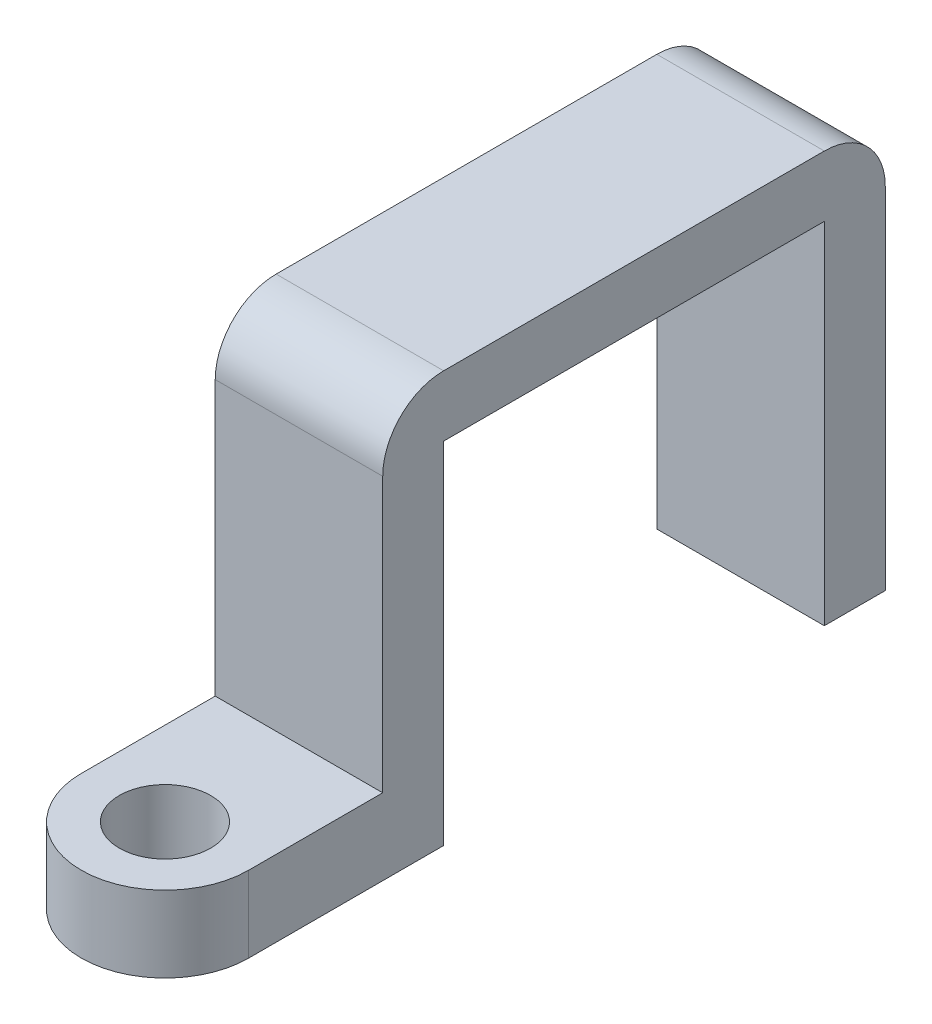
ISO-10303-21;
HEADER;
FILE_DESCRIPTION(('STEP AP214'),'2;1');
FILE_NAME('part.step','',(''),(''),'','','');
FILE_SCHEMA(('AUTOMOTIVE_DESIGN { 1 0 10303 214 1 1 1 1 }'));
ENDSEC;
DATA;
#1=APPLICATION_CONTEXT('core data for automotive mechanical design processes');
#2=APPLICATION_PROTOCOL_DEFINITION('international standard','automotive_design',2000,#1);
#3=PRODUCT_CONTEXT('',#1,'mechanical');
#4=PRODUCT('Part','Part','',(#3));
#5=PRODUCT_RELATED_PRODUCT_CATEGORY('part','',(#4));
#6=PRODUCT_DEFINITION_FORMATION('','',#4);
#7=PRODUCT_DEFINITION_CONTEXT('part definition',#1,'design');
#8=PRODUCT_DEFINITION('design','',#6,#7);
#9=PRODUCT_DEFINITION_SHAPE('','',#8);
#10=(LENGTH_UNIT() NAMED_UNIT(*) SI_UNIT(.MILLI.,.METRE.));
#11=(NAMED_UNIT(*) PLANE_ANGLE_UNIT() SI_UNIT($,.RADIAN.));
#12=(NAMED_UNIT(*) SI_UNIT($,.STERADIAN.) SOLID_ANGLE_UNIT());
#13=UNCERTAINTY_MEASURE_WITH_UNIT(LENGTH_MEASURE(1.E-05),#10,'distance_accuracy_value','');
#14=(GEOMETRIC_REPRESENTATION_CONTEXT(3) GLOBAL_UNCERTAINTY_ASSIGNED_CONTEXT((#13)) GLOBAL_UNIT_ASSIGNED_CONTEXT((#10,
#11,#12)) REPRESENTATION_CONTEXT('',''));
#15=CARTESIAN_POINT('',(0.,0.,0.));
#16=DIRECTION('',(0.,0.,1.));
#17=DIRECTION('',(1.,0.,0.));
#18=AXIS2_PLACEMENT_3D('',#15,#16,#17);
#19=CARTESIAN_POINT('',(0.,11.5,0.));
#20=DIRECTION('',(0.,-1.,0.));
#21=DIRECTION('',(0.,0.,-1.));
#22=AXIS2_PLACEMENT_3D('',#19,#20,#21);
#23=PLANE('',#22);
#24=DIRECTION('',(0.,0.,1.));
#25=VECTOR('',#24,1.);
#26=CARTESIAN_POINT('',(-2.75,11.5,-20.9));
#27=LINE('',#26,#25);
#28=CARTESIAN_POINT('',(-2.75,11.5,-18.9));
#29=VERTEX_POINT('',#28);
#30=CARTESIAN_POINT('',(-2.75,11.5,-6.4));
#31=VERTEX_POINT('',#30);
#32=EDGE_CURVE('E179',#29,#31,#27,.T.);
#33=ORIENTED_EDGE('',*,*,#32,.F.);
#34=DIRECTION('',(-1.,0.,0.));
#35=VECTOR('',#34,1.);
#36=CARTESIAN_POINT('',(-2.75,11.5,-18.9));
#37=LINE('',#36,#35);
#38=CARTESIAN_POINT('',(2.75,11.5,-18.9));
#39=VERTEX_POINT('',#38);
#40=EDGE_CURVE('E159',#39,#29,#37,.T.);
#41=ORIENTED_EDGE('',*,*,#40,.F.);
#42=DIRECTION('',(0.,0.,-1.));
#43=VECTOR('',#42,1.);
#44=CARTESIAN_POINT('',(2.75,11.5,-20.9));
#45=LINE('',#44,#43);
#46=CARTESIAN_POINT('',(2.75,11.5,-6.4));
#47=VERTEX_POINT('',#46);
#48=EDGE_CURVE('E174',#47,#39,#45,.T.);
#49=ORIENTED_EDGE('',*,*,#48,.F.);
#50=DIRECTION('',(-1.,0.,0.));
#51=VECTOR('',#50,1.);
#52=CARTESIAN_POINT('',(2.75,11.5,-6.4));
#53=LINE('',#52,#51);
#54=EDGE_CURVE('E191',#47,#31,#53,.T.);
#55=ORIENTED_EDGE('',*,*,#54,.T.);
#56=EDGE_LOOP('',(#33,#41,#49,#55));
#57=FACE_BOUND('',#56,.T.);
#58=ADVANCED_FACE('F45',(#57),#23,.T.);
#59=CARTESIAN_POINT('',(0.,2.5,0.));
#60=DIRECTION('',(0.,1.,0.));
#61=DIRECTION('',(0.,0.,1.));
#62=AXIS2_PLACEMENT_3D('',#59,#60,#61);
#63=PLANE('',#62);
#64=DIRECTION('',(1.,0.,0.));
#65=VECTOR('',#64,1.);
#66=CARTESIAN_POINT('',(-2.75,2.5,-4.4));
#67=LINE('',#66,#65);
#68=CARTESIAN_POINT('',(-2.75,2.5,-4.4));
#69=VERTEX_POINT('',#68);
#70=CARTESIAN_POINT('',(2.75,2.5,-4.4));
#71=VERTEX_POINT('',#70);
#72=EDGE_CURVE('E190',#69,#71,#67,.T.);
#73=ORIENTED_EDGE('',*,*,#72,.F.);
#74=DIRECTION('',(0.,0.,1.));
#75=VECTOR('',#74,1.);
#76=CARTESIAN_POINT('',(-2.75,2.5,0.));
#77=LINE('',#76,#75);
#78=CARTESIAN_POINT('',(-2.75,2.5,0.));
#79=VERTEX_POINT('',#78);
#80=EDGE_CURVE('E222',#69,#79,#77,.T.);
#81=ORIENTED_EDGE('',*,*,#80,.T.);
#82=CARTESIAN_POINT('',(0.,2.5,0.));
#83=DIRECTION('',(0.,1.,0.));
#84=DIRECTION('',(0.,0.,1.));
#85=AXIS2_PLACEMENT_3D('',#82,#83,#84);
#86=CIRCLE('',#85,2.75);
#87=CARTESIAN_POINT('',(2.75,2.5,0.));
#88=VERTEX_POINT('',#87);
#89=EDGE_CURVE('E213',#79,#88,#86,.T.);
#90=ORIENTED_EDGE('',*,*,#89,.T.);
#91=DIRECTION('',(0.,0.,-1.));
#92=VECTOR('',#91,1.);
#93=CARTESIAN_POINT('',(2.75,2.5,0.));
#94=LINE('',#93,#92);
#95=EDGE_CURVE('E217',#88,#71,#94,.T.);
#96=ORIENTED_EDGE('',*,*,#95,.T.);
#97=EDGE_LOOP('',(#73,#81,#90,#96));
#98=FACE_BOUND('',#97,.T.);
#99=CARTESIAN_POINT('',(0.,2.5,0.));
#100=DIRECTION('',(0.,1.,0.));
#101=DIRECTION('',(0.,0.,1.));
#102=AXIS2_PLACEMENT_3D('',#99,#100,#101);
#103=CIRCLE('',#102,1.5);
#104=CARTESIAN_POINT('',(0.,2.5,1.5));
#105=VERTEX_POINT('',#104);
#106=EDGE_CURVE('E205',#105,#105,#103,.T.);
#107=ORIENTED_EDGE('',*,*,#106,.F.);
#108=EDGE_LOOP('',(#107));
#109=FACE_BOUND('',#108,.T.);
#110=ADVANCED_FACE('F284',(#98,#109),#63,.T.);
#111=CARTESIAN_POINT('',(0.,0.,0.));
#112=DIRECTION('',(0.,1.,0.));
#113=DIRECTION('',(0.,0.,1.));
#114=AXIS2_PLACEMENT_3D('',#111,#112,#113);
#115=PLANE('',#114);
#116=CARTESIAN_POINT('',(0.,0.,0.));
#117=DIRECTION('',(0.,1.,0.));
#118=DIRECTION('',(0.,0.,1.));
#119=AXIS2_PLACEMENT_3D('',#116,#117,#118);
#120=CIRCLE('',#119,2.75);
#121=CARTESIAN_POINT('',(-2.75,0.,0.));
#122=VERTEX_POINT('',#121);
#123=CARTESIAN_POINT('',(2.75,0.,0.));
#124=VERTEX_POINT('',#123);
#125=EDGE_CURVE('E209',#122,#124,#120,.T.);
#126=ORIENTED_EDGE('',*,*,#125,.F.);
#127=DIRECTION('',(0.,0.,1.));
#128=VECTOR('',#127,1.);
#129=CARTESIAN_POINT('',(-2.75,0.,0.));
#130=LINE('',#129,#128);
#131=CARTESIAN_POINT('',(-2.75,0.,-6.4));
#132=VERTEX_POINT('',#131);
#133=EDGE_CURVE('E218',#132,#122,#130,.T.);
#134=ORIENTED_EDGE('',*,*,#133,.F.);
#135=DIRECTION('',(-1.,0.,0.));
#136=VECTOR('',#135,1.);
#137=CARTESIAN_POINT('',(-2.75,0.,-6.4));
#138=LINE('',#137,#136);
#139=CARTESIAN_POINT('',(2.75,0.,-6.4));
#140=VERTEX_POINT('',#139);
#141=EDGE_CURVE('E232',#140,#132,#138,.T.);
#142=ORIENTED_EDGE('',*,*,#141,.F.);
#143=DIRECTION('',(0.,0.,-1.));
#144=VECTOR('',#143,1.);
#145=CARTESIAN_POINT('',(2.75,0.,0.));
#146=LINE('',#145,#144);
#147=EDGE_CURVE('E229',#124,#140,#146,.T.);
#148=ORIENTED_EDGE('',*,*,#147,.F.);
#149=EDGE_LOOP('',(#126,#134,#142,#148));
#150=FACE_BOUND('',#149,.T.);
#151=CARTESIAN_POINT('',(0.,0.,0.));
#152=DIRECTION('',(0.,1.,0.));
#153=DIRECTION('',(0.,0.,1.));
#154=AXIS2_PLACEMENT_3D('',#151,#152,#153);
#155=CIRCLE('',#154,1.5);
#156=CARTESIAN_POINT('',(0.,0.,1.5));
#157=VERTEX_POINT('',#156);
#158=EDGE_CURVE('E204',#157,#157,#155,.T.);
#159=ORIENTED_EDGE('',*,*,#158,.T.);
#160=EDGE_LOOP('',(#159));
#161=FACE_BOUND('',#160,.T.);
#162=ADVANCED_FACE('F300',(#150,#161),#115,.F.);
#163=CARTESIAN_POINT('',(0.,2.5,0.));
#164=DIRECTION('',(0.,-1.,0.));
#165=DIRECTION('',(0.,0.,-1.));
#166=AXIS2_PLACEMENT_3D('',#163,#164,#165);
#167=CYLINDRICAL_SURFACE('',#166,2.75);
#168=ORIENTED_EDGE('',*,*,#125,.T.);
#169=DIRECTION('',(0.,-1.,0.));
#170=VECTOR('',#169,1.);
#171=CARTESIAN_POINT('',(2.75,2.5,0.));
#172=LINE('',#171,#170);
#173=EDGE_CURVE('E248',#88,#124,#172,.T.);
#174=ORIENTED_EDGE('',*,*,#173,.F.);
#175=ORIENTED_EDGE('',*,*,#89,.F.);
#176=DIRECTION('',(0.,-1.,0.));
#177=VECTOR('',#176,1.);
#178=CARTESIAN_POINT('',(-2.75,2.5,0.));
#179=LINE('',#178,#177);
#180=EDGE_CURVE('E225',#79,#122,#179,.T.);
#181=ORIENTED_EDGE('',*,*,#180,.T.);
#182=EDGE_LOOP('',(#168,#174,#175,#181));
#183=FACE_BOUND('',#182,.T.);
#184=ADVANCED_FACE('F292',(#183),#167,.T.);
#185=CARTESIAN_POINT('',(2.75,2.5,0.));
#186=DIRECTION('',(-1.,0.,0.));
#187=DIRECTION('',(0.,0.,1.));
#188=AXIS2_PLACEMENT_3D('',#185,#186,#187);
#189=PLANE('',#188);
#190=DIRECTION('',(0.,0.,-1.));
#191=VECTOR('',#190,1.);
#192=CARTESIAN_POINT('',(2.75,13.5,-20.9));
#193=LINE('',#192,#191);
#194=CARTESIAN_POINT('',(2.75,13.5,-6.4));
#195=VERTEX_POINT('',#194);
#196=CARTESIAN_POINT('',(2.75,13.5,-18.9));
#197=VERTEX_POINT('',#196);
#198=EDGE_CURVE('E175',#195,#197,#193,.T.);
#199=ORIENTED_EDGE('',*,*,#198,.F.);
#200=CARTESIAN_POINT('',(2.75,11.5,-6.4));
#201=DIRECTION('',(-1.,0.,0.));
#202=DIRECTION('',(0.,0.,1.));
#203=AXIS2_PLACEMENT_3D('',#200,#201,#202);
#204=CIRCLE('',#203,2.);
#205=CARTESIAN_POINT('',(2.75,11.5,-4.4));
#206=VERTEX_POINT('',#205);
#207=EDGE_CURVE('E263',#195,#206,#204,.F.);
#208=ORIENTED_EDGE('',*,*,#207,.T.);
#209=DIRECTION('',(0.,-1.,0.));
#210=VECTOR('',#209,1.);
#211=CARTESIAN_POINT('',(2.75,11.5,-4.4));
#212=LINE('',#211,#210);
#213=EDGE_CURVE('E195',#206,#71,#212,.T.);
#214=ORIENTED_EDGE('',*,*,#213,.T.);
#215=ORIENTED_EDGE('',*,*,#95,.F.);
#216=ORIENTED_EDGE('',*,*,#173,.T.);
#217=ORIENTED_EDGE('',*,*,#147,.T.);
#218=DIRECTION('',(0.,-1.,0.));
#219=VECTOR('',#218,1.);
#220=CARTESIAN_POINT('',(2.75,2.5,-6.4));
#221=LINE('',#220,#219);
#222=EDGE_CURVE('E244',#47,#140,#221,.T.);
#223=ORIENTED_EDGE('',*,*,#222,.F.);
#224=ORIENTED_EDGE('',*,*,#48,.T.);
#225=DIRECTION('',(0.,1.,0.));
#226=VECTOR('',#225,1.);
#227=CARTESIAN_POINT('',(2.75,0.,-18.9));
#228=LINE('',#227,#226);
#229=CARTESIAN_POINT('',(2.75,0.,-18.9));
#230=VERTEX_POINT('',#229);
#231=EDGE_CURVE('E171',#230,#39,#228,.T.);
#232=ORIENTED_EDGE('',*,*,#231,.F.);
#233=DIRECTION('',(0.,0.,1.));
#234=VECTOR('',#233,1.);
#235=CARTESIAN_POINT('',(2.75,0.,-20.9));
#236=LINE('',#235,#234);
#237=CARTESIAN_POINT('',(2.75,0.,-20.9));
#238=VERTEX_POINT('',#237);
#239=EDGE_CURVE('E152',#238,#230,#236,.T.);
#240=ORIENTED_EDGE('',*,*,#239,.F.);
#241=DIRECTION('',(0.,-1.,0.));
#242=VECTOR('',#241,1.);
#243=CARTESIAN_POINT('',(2.75,13.5,-20.9));
#244=LINE('',#243,#242);
#245=CARTESIAN_POINT('',(2.75,11.5,-20.9));
#246=VERTEX_POINT('',#245);
#247=EDGE_CURVE('E142',#246,#238,#244,.T.);
#248=ORIENTED_EDGE('',*,*,#247,.F.);
#249=CARTESIAN_POINT('',(2.75,11.5,-18.9));
#250=DIRECTION('',(-1.,0.,0.));
#251=DIRECTION('',(0.,0.,1.));
#252=AXIS2_PLACEMENT_3D('',#249,#250,#251);
#253=CIRCLE('',#252,2.);
#254=EDGE_CURVE('E260',#246,#197,#253,.F.);
#255=ORIENTED_EDGE('',*,*,#254,.T.);
#256=EDGE_LOOP('',(#199,#208,#214,#215,#216,#217,#223,#224,#232,#240,#248,#255));
#257=FACE_BOUND('',#256,.T.);
#258=ADVANCED_FACE('F280',(#257),#189,.F.);
#259=CARTESIAN_POINT('',(-2.75,2.5,-6.4));
#260=DIRECTION('',(0.,0.,1.));
#261=DIRECTION('',(1.,0.,0.));
#262=AXIS2_PLACEMENT_3D('',#259,#260,#261);
#263=PLANE('',#262);
#264=ORIENTED_EDGE('',*,*,#141,.T.);
#265=DIRECTION('',(0.,-1.,0.));
#266=VECTOR('',#265,1.);
#267=CARTESIAN_POINT('',(-2.75,2.5,-6.4));
#268=LINE('',#267,#266);
#269=EDGE_CURVE('E240',#31,#132,#268,.T.);
#270=ORIENTED_EDGE('',*,*,#269,.F.);
#271=ORIENTED_EDGE('',*,*,#54,.F.);
#272=ORIENTED_EDGE('',*,*,#222,.T.);
#273=EDGE_LOOP('',(#264,#270,#271,#272));
#274=FACE_BOUND('',#273,.T.);
#275=ADVANCED_FACE('F297',(#274),#263,.F.);
#276=CARTESIAN_POINT('',(-2.75,2.5,0.));
#277=DIRECTION('',(1.,0.,0.));
#278=DIRECTION('',(0.,0.,-1.));
#279=AXIS2_PLACEMENT_3D('',#276,#277,#278);
#280=PLANE('',#279);
#281=DIRECTION('',(0.,-1.,0.));
#282=VECTOR('',#281,1.);
#283=CARTESIAN_POINT('',(-2.75,11.5,-4.4));
#284=LINE('',#283,#282);
#285=CARTESIAN_POINT('',(-2.75,11.5,-4.4));
#286=VERTEX_POINT('',#285);
#287=EDGE_CURVE('E201',#286,#69,#284,.T.);
#288=ORIENTED_EDGE('',*,*,#287,.F.);
#289=CARTESIAN_POINT('',(-2.75,11.5,-6.4));
#290=DIRECTION('',(1.,0.,0.));
#291=DIRECTION('',(0.,0.,-1.));
#292=AXIS2_PLACEMENT_3D('',#289,#290,#291);
#293=CIRCLE('',#292,2.);
#294=CARTESIAN_POINT('',(-2.75,13.5,-6.4));
#295=VERTEX_POINT('',#294);
#296=EDGE_CURVE('E54',#286,#295,#293,.F.);
#297=ORIENTED_EDGE('',*,*,#296,.T.);
#298=DIRECTION('',(0.,0.,1.));
#299=VECTOR('',#298,1.);
#300=CARTESIAN_POINT('',(-2.75,13.5,-20.9));
#301=LINE('',#300,#299);
#302=CARTESIAN_POINT('',(-2.75,13.5,-18.9));
#303=VERTEX_POINT('',#302);
#304=EDGE_CURVE('E143',#303,#295,#301,.T.);
#305=ORIENTED_EDGE('',*,*,#304,.F.);
#306=CARTESIAN_POINT('',(-2.75,11.5,-18.9));
#307=DIRECTION('',(1.,0.,0.));
#308=DIRECTION('',(0.,0.,-1.));
#309=AXIS2_PLACEMENT_3D('',#306,#307,#308);
#310=CIRCLE('',#309,2.);
#311=CARTESIAN_POINT('',(-2.75,11.5,-20.9));
#312=VERTEX_POINT('',#311);
#313=EDGE_CURVE('E61',#303,#312,#310,.F.);
#314=ORIENTED_EDGE('',*,*,#313,.T.);
#315=DIRECTION('',(0.,-1.,0.));
#316=VECTOR('',#315,1.);
#317=CARTESIAN_POINT('',(-2.75,13.5,-20.9));
#318=LINE('',#317,#316);
#319=CARTESIAN_POINT('',(-2.75,0.,-20.9));
#320=VERTEX_POINT('',#319);
#321=EDGE_CURVE('E133',#312,#320,#318,.T.);
#322=ORIENTED_EDGE('',*,*,#321,.T.);
#323=DIRECTION('',(0.,0.,-1.));
#324=VECTOR('',#323,1.);
#325=CARTESIAN_POINT('',(-2.75,0.,-20.9));
#326=LINE('',#325,#324);
#327=CARTESIAN_POINT('',(-2.75,0.,-18.9));
#328=VERTEX_POINT('',#327);
#329=EDGE_CURVE('E138',#328,#320,#326,.T.);
#330=ORIENTED_EDGE('',*,*,#329,.F.);
#331=DIRECTION('',(0.,1.,0.));
#332=VECTOR('',#331,1.);
#333=CARTESIAN_POINT('',(-2.75,0.,-18.9));
#334=LINE('',#333,#332);
#335=EDGE_CURVE('E167',#328,#29,#334,.T.);
#336=ORIENTED_EDGE('',*,*,#335,.T.);
#337=ORIENTED_EDGE('',*,*,#32,.T.);
#338=ORIENTED_EDGE('',*,*,#269,.T.);
#339=ORIENTED_EDGE('',*,*,#133,.T.);
#340=ORIENTED_EDGE('',*,*,#180,.F.);
#341=ORIENTED_EDGE('',*,*,#80,.F.);
#342=EDGE_LOOP('',(#288,#297,#305,#314,#322,#330,#336,#337,#338,#339,#340,#341));
#343=FACE_BOUND('',#342,.T.);
#344=ADVANCED_FACE('F135',(#343),#280,.F.);
#345=CARTESIAN_POINT('',(0.,2.5,0.));
#346=DIRECTION('',(0.,-1.,0.));
#347=DIRECTION('',(0.,0.,-1.));
#348=AXIS2_PLACEMENT_3D('',#345,#346,#347);
#349=CYLINDRICAL_SURFACE('',#348,1.5);
#350=ORIENTED_EDGE('',*,*,#106,.T.);
#351=EDGE_LOOP('',(#350));
#352=FACE_BOUND('',#351,.T.);
#353=ORIENTED_EDGE('',*,*,#158,.F.);
#354=EDGE_LOOP('',(#353));
#355=FACE_BOUND('',#354,.T.);
#356=ADVANCED_FACE('F306',(#352,#355),#349,.F.);
#357=CARTESIAN_POINT('',(-2.75,11.5,-4.4));
#358=DIRECTION('',(0.,0.,-1.));
#359=DIRECTION('',(-1.,0.,0.));
#360=AXIS2_PLACEMENT_3D('',#357,#358,#359);
#361=PLANE('',#360);
#362=ORIENTED_EDGE('',*,*,#213,.F.);
#363=DIRECTION('',(1.,0.,0.));
#364=VECTOR('',#363,1.);
#365=CARTESIAN_POINT('',(-2.75,11.5,-4.4));
#366=LINE('',#365,#364);
#367=EDGE_CURVE('E69',#206,#286,#366,.F.);
#368=ORIENTED_EDGE('',*,*,#367,.T.);
#369=ORIENTED_EDGE('',*,*,#287,.T.);
#370=ORIENTED_EDGE('',*,*,#72,.T.);
#371=EDGE_LOOP('',(#362,#368,#369,#370));
#372=FACE_BOUND('',#371,.T.);
#373=ADVANCED_FACE('F281',(#372),#361,.F.);
#374=CARTESIAN_POINT('',(2.75,13.5,-20.9));
#375=DIRECTION('',(0.,0.,1.));
#376=DIRECTION('',(1.,0.,0.));
#377=AXIS2_PLACEMENT_3D('',#374,#375,#376);
#378=PLANE('',#377);
#379=ORIENTED_EDGE('',*,*,#321,.F.);
#380=DIRECTION('',(-1.,0.,0.));
#381=VECTOR('',#380,1.);
#382=CARTESIAN_POINT('',(2.75,11.5,-20.9));
#383=LINE('',#382,#381);
#384=EDGE_CURVE('E11',#312,#246,#383,.F.);
#385=ORIENTED_EDGE('',*,*,#384,.T.);
#386=ORIENTED_EDGE('',*,*,#247,.T.);
#387=DIRECTION('',(1.,0.,0.));
#388=VECTOR('',#387,1.);
#389=CARTESIAN_POINT('',(-2.75,0.,-20.9));
#390=LINE('',#389,#388);
#391=EDGE_CURVE('E146',#320,#238,#390,.T.);
#392=ORIENTED_EDGE('',*,*,#391,.F.);
#393=EDGE_LOOP('',(#379,#385,#386,#392));
#394=FACE_BOUND('',#393,.T.);
#395=ADVANCED_FACE('F147',(#394),#378,.F.);
#396=CARTESIAN_POINT('',(0.,13.5,0.));
#397=DIRECTION('',(0.,-1.,0.));
#398=DIRECTION('',(0.,0.,-1.));
#399=AXIS2_PLACEMENT_3D('',#396,#397,#398);
#400=PLANE('',#399);
#401=ORIENTED_EDGE('',*,*,#304,.T.);
#402=DIRECTION('',(1.,0.,0.));
#403=VECTOR('',#402,1.);
#404=CARTESIAN_POINT('',(0.,13.5,-6.4));
#405=LINE('',#404,#403);
#406=EDGE_CURVE('E256',#295,#195,#405,.T.);
#407=ORIENTED_EDGE('',*,*,#406,.T.);
#408=ORIENTED_EDGE('',*,*,#198,.T.);
#409=DIRECTION('',(-1.,0.,0.));
#410=VECTOR('',#409,1.);
#411=CARTESIAN_POINT('',(0.,13.5,-18.9));
#412=LINE('',#411,#410);
#413=EDGE_CURVE('E252',#197,#303,#412,.T.);
#414=ORIENTED_EDGE('',*,*,#413,.T.);
#415=EDGE_LOOP('',(#401,#407,#408,#414));
#416=FACE_BOUND('',#415,.T.);
#417=ADVANCED_FACE('F275',(#416),#400,.F.);
#418=CARTESIAN_POINT('',(-2.75,0.,-18.9));
#419=DIRECTION('',(0.,0.,-1.));
#420=DIRECTION('',(-1.,0.,0.));
#421=AXIS2_PLACEMENT_3D('',#418,#419,#420);
#422=PLANE('',#421);
#423=ORIENTED_EDGE('',*,*,#40,.T.);
#424=ORIENTED_EDGE('',*,*,#335,.F.);
#425=DIRECTION('',(-1.,0.,0.));
#426=VECTOR('',#425,1.);
#427=CARTESIAN_POINT('',(-2.75,0.,-18.9));
#428=LINE('',#427,#426);
#429=EDGE_CURVE('E156',#230,#328,#428,.T.);
#430=ORIENTED_EDGE('',*,*,#429,.F.);
#431=ORIENTED_EDGE('',*,*,#231,.T.);
#432=EDGE_LOOP('',(#423,#424,#430,#431));
#433=FACE_BOUND('',#432,.T.);
#434=ADVANCED_FACE('F334',(#433),#422,.F.);
#435=CARTESIAN_POINT('',(0.,0.,0.));
#436=DIRECTION('',(0.,1.,0.));
#437=DIRECTION('',(0.,0.,1.));
#438=AXIS2_PLACEMENT_3D('',#435,#436,#437);
#439=PLANE('',#438);
#440=ORIENTED_EDGE('',*,*,#329,.T.);
#441=ORIENTED_EDGE('',*,*,#391,.T.);
#442=ORIENTED_EDGE('',*,*,#239,.T.);
#443=ORIENTED_EDGE('',*,*,#429,.T.);
#444=EDGE_LOOP('',(#440,#441,#442,#443));
#445=FACE_BOUND('',#444,.T.);
#446=ADVANCED_FACE('F154',(#445),#439,.F.);
#447=CARTESIAN_POINT('',(0.,11.5,-6.4));
#448=DIRECTION('',(1.,0.,0.));
#449=DIRECTION('',(0.,0.,-1.));
#450=AXIS2_PLACEMENT_3D('',#447,#448,#449);
#451=CYLINDRICAL_SURFACE('',#450,2.);
#452=ORIENTED_EDGE('',*,*,#296,.F.);
#453=ORIENTED_EDGE('',*,*,#367,.F.);
#454=ORIENTED_EDGE('',*,*,#207,.F.);
#455=ORIENTED_EDGE('',*,*,#406,.F.);
#456=EDGE_LOOP('',(#452,#453,#454,#455));
#457=FACE_BOUND('',#456,.T.);
#458=ADVANCED_FACE('F278',(#457),#451,.T.);
#459=CARTESIAN_POINT('',(0.,11.5,-18.9));
#460=DIRECTION('',(-1.,0.,0.));
#461=DIRECTION('',(0.,0.,1.));
#462=AXIS2_PLACEMENT_3D('',#459,#460,#461);
#463=CYLINDRICAL_SURFACE('',#462,2.);
#464=ORIENTED_EDGE('',*,*,#254,.F.);
#465=ORIENTED_EDGE('',*,*,#384,.F.);
#466=ORIENTED_EDGE('',*,*,#313,.F.);
#467=ORIENTED_EDGE('',*,*,#413,.F.);
#468=EDGE_LOOP('',(#464,#465,#466,#467));
#469=FACE_BOUND('',#468,.T.);
#470=ADVANCED_FACE('F47',(#469),#463,.T.);
#471=CLOSED_SHELL('',(#58,#110,#162,#184,#258,#275,#344,#356,#373,#395,#417,#434,#446,#458,#470));
#472=MANIFOLD_SOLID_BREP('B2',#471);
#473=ADVANCED_BREP_SHAPE_REPRESENTATION('',(#18,#472),#14);
#474=SHAPE_DEFINITION_REPRESENTATION(#9,#473);
ENDSEC;
END-ISO-10303-21;
